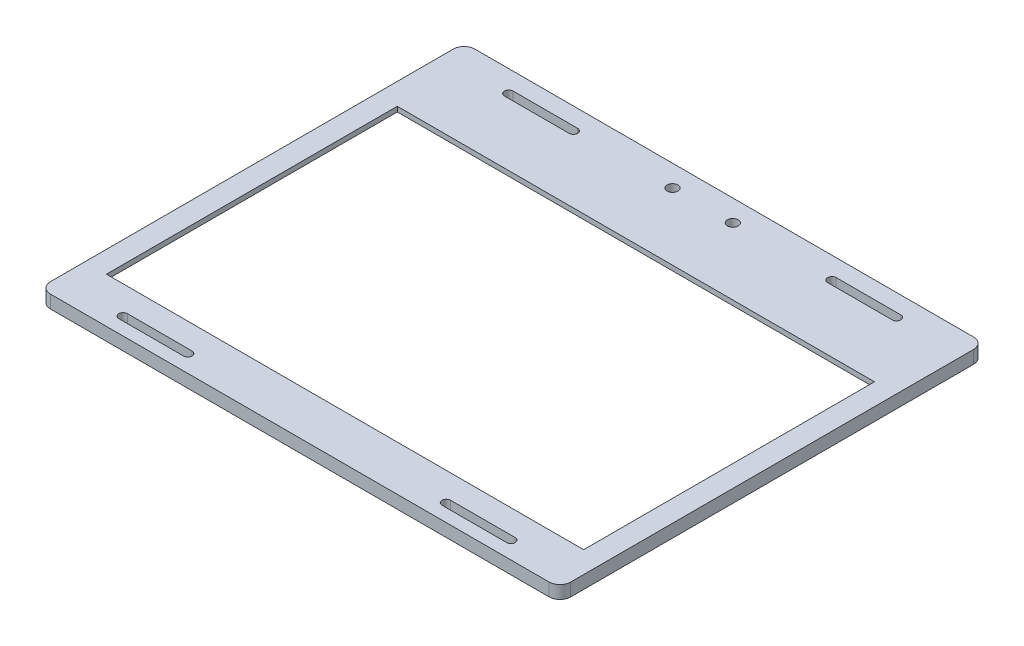
ISO-10303-21;
HEADER;
FILE_DESCRIPTION(('STEP AP214'),'2;1');
FILE_NAME('part.step','',(''),(''),'','','');
FILE_SCHEMA(('AUTOMOTIVE_DESIGN { 1 0 10303 214 1 1 1 1 }'));
ENDSEC;
DATA;
#1=APPLICATION_CONTEXT('core data for automotive mechanical design processes');
#2=APPLICATION_PROTOCOL_DEFINITION('international standard','automotive_design',2000,#1);
#3=PRODUCT_CONTEXT('',#1,'mechanical');
#4=PRODUCT('Part','Part','',(#3));
#5=PRODUCT_RELATED_PRODUCT_CATEGORY('part','',(#4));
#6=PRODUCT_DEFINITION_FORMATION('','',#4);
#7=PRODUCT_DEFINITION_CONTEXT('part definition',#1,'design');
#8=PRODUCT_DEFINITION('design','',#6,#7);
#9=PRODUCT_DEFINITION_SHAPE('','',#8);
#10=(LENGTH_UNIT() NAMED_UNIT(*) SI_UNIT(.MILLI.,.METRE.));
#11=(NAMED_UNIT(*) PLANE_ANGLE_UNIT() SI_UNIT($,.RADIAN.));
#12=(NAMED_UNIT(*) SI_UNIT($,.STERADIAN.) SOLID_ANGLE_UNIT());
#13=UNCERTAINTY_MEASURE_WITH_UNIT(LENGTH_MEASURE(1.E-05),#10,'distance_accuracy_value','');
#14=(GEOMETRIC_REPRESENTATION_CONTEXT(3) GLOBAL_UNCERTAINTY_ASSIGNED_CONTEXT((#13)) GLOBAL_UNIT_ASSIGNED_CONTEXT((#10,
#11,#12)) REPRESENTATION_CONTEXT('',''));
#15=CARTESIAN_POINT('',(0.,0.,0.));
#16=DIRECTION('',(0.,0.,1.));
#17=DIRECTION('',(1.,0.,0.));
#18=AXIS2_PLACEMENT_3D('',#15,#16,#17);
#19=CARTESIAN_POINT('',(0.,3.7,0.));
#20=DIRECTION('',(0.,1.,0.));
#21=DIRECTION('',(0.,0.,1.));
#22=AXIS2_PLACEMENT_3D('',#19,#20,#21);
#23=PLANE('',#22);
#24=DIRECTION('',(0.,0.,1.));
#25=VECTOR('',#24,1.);
#26=CARTESIAN_POINT('',(110.75,3.7,0.));
#27=LINE('',#26,#25);
#28=CARTESIAN_POINT('',(110.75,3.7,-60.));
#29=VERTEX_POINT('',#28);
#30=CARTESIAN_POINT('',(110.75,3.7,75.));
#31=VERTEX_POINT('',#30);
#32=EDGE_CURVE('E11',#29,#31,#27,.T.);
#33=ORIENTED_EDGE('',*,*,#32,.F.);
#34=DIRECTION('',(-1.,0.,0.));
#35=VECTOR('',#34,1.);
#36=CARTESIAN_POINT('',(0.,3.7,-60.));
#37=LINE('',#36,#35);
#38=CARTESIAN_POINT('',(-110.75,3.7,-60.));
#39=VERTEX_POINT('',#38);
#40=EDGE_CURVE('E47',#29,#39,#37,.T.);
#41=ORIENTED_EDGE('',*,*,#40,.T.);
#42=DIRECTION('',(0.,0.,1.));
#43=VECTOR('',#42,1.);
#44=CARTESIAN_POINT('',(-110.75,3.7,0.));
#45=LINE('',#44,#43);
#46=CARTESIAN_POINT('',(-110.75,3.7,75.));
#47=VERTEX_POINT('',#46);
#48=EDGE_CURVE('E505',#39,#47,#45,.T.);
#49=ORIENTED_EDGE('',*,*,#48,.T.);
#50=DIRECTION('',(1.,0.,0.));
#51=VECTOR('',#50,1.);
#52=CARTESIAN_POINT('',(-114.75,3.7,75.));
#53=LINE('',#52,#51);
#54=CARTESIAN_POINT('',(-114.75,3.7,75.));
#55=VERTEX_POINT('',#54);
#56=EDGE_CURVE('E255',#55,#47,#53,.T.);
#57=ORIENTED_EDGE('',*,*,#56,.F.);
#58=DIRECTION('',(0.,0.,1.));
#59=VECTOR('',#58,1.);
#60=CARTESIAN_POINT('',(-114.75,3.7,-75.));
#61=LINE('',#60,#59);
#62=CARTESIAN_POINT('',(-114.75,3.7,-75.));
#63=VERTEX_POINT('',#62);
#64=EDGE_CURVE('E277',#63,#55,#61,.T.);
#65=ORIENTED_EDGE('',*,*,#64,.F.);
#66=DIRECTION('',(1.,0.,0.));
#67=VECTOR('',#66,1.);
#68=CARTESIAN_POINT('',(-114.75,3.7,-75.));
#69=LINE('',#68,#67);
#70=CARTESIAN_POINT('',(114.75,3.7,-75.));
#71=VERTEX_POINT('',#70);
#72=EDGE_CURVE('E286',#63,#71,#69,.T.);
#73=ORIENTED_EDGE('',*,*,#72,.T.);
#74=DIRECTION('',(0.,0.,1.));
#75=VECTOR('',#74,1.);
#76=CARTESIAN_POINT('',(114.75,3.7,-75.));
#77=LINE('',#76,#75);
#78=CARTESIAN_POINT('',(114.75,3.7,75.));
#79=VERTEX_POINT('',#78);
#80=EDGE_CURVE('E283',#71,#79,#77,.T.);
#81=ORIENTED_EDGE('',*,*,#80,.T.);
#82=EDGE_CURVE('E280',#31,#79,#53,.T.);
#83=ORIENTED_EDGE('',*,*,#82,.F.);
#84=EDGE_LOOP('',(#33,#41,#49,#57,#65,#73,#81,#83));
#85=FACE_BOUND('',#84,.T.);
#86=ADVANCED_FACE('F39',(#85),#23,.F.);
#87=CARTESIAN_POINT('',(0.,0.,0.));
#88=DIRECTION('',(0.,1.,0.));
#89=DIRECTION('',(0.,0.,1.));
#90=AXIS2_PLACEMENT_3D('',#87,#88,#89);
#91=PLANE('',#90);
#92=DIRECTION('',(-1.,0.,0.));
#93=VECTOR('',#92,1.);
#94=CARTESIAN_POINT('',(0.,0.,90.));
#95=LINE('',#94,#93);
#96=CARTESIAN_POINT('',(90.,0.,89.9999999999999));
#97=VERTEX_POINT('',#96);
#98=CARTESIAN_POINT('',(60.,0.,90.));
#99=VERTEX_POINT('',#98);
#100=EDGE_CURVE('E444',#97,#99,#95,.T.);
#101=ORIENTED_EDGE('',*,*,#100,.F.);
#102=CARTESIAN_POINT('',(90.,0.,87.9999999999999));
#103=DIRECTION('',(0.,1.,0.));
#104=DIRECTION('',(0.,0.,1.));
#105=AXIS2_PLACEMENT_3D('',#102,#103,#104);
#106=CIRCLE('',#105,2.);
#107=CARTESIAN_POINT('',(90.,0.,85.9999999999999));
#108=VERTEX_POINT('',#107);
#109=EDGE_CURVE('E408',#108,#97,#106,.F.);
#110=ORIENTED_EDGE('',*,*,#109,.F.);
#111=DIRECTION('',(-1.,0.,0.));
#112=VECTOR('',#111,1.);
#113=CARTESIAN_POINT('',(0.,0.,86.));
#114=LINE('',#113,#112);
#115=CARTESIAN_POINT('',(60.,0.,86.));
#116=VERTEX_POINT('',#115);
#117=EDGE_CURVE('E450',#108,#116,#114,.T.);
#118=ORIENTED_EDGE('',*,*,#117,.T.);
#119=CARTESIAN_POINT('',(60.,0.,88.));
#120=DIRECTION('',(0.,1.,0.));
#121=DIRECTION('',(0.,0.,1.));
#122=AXIS2_PLACEMENT_3D('',#119,#120,#121);
#123=CIRCLE('',#122,2.);
#124=EDGE_CURVE('E447',#99,#116,#123,.F.);
#125=ORIENTED_EDGE('',*,*,#124,.F.);
#126=EDGE_LOOP('',(#101,#110,#118,#125));
#127=FACE_BOUND('',#126,.T.);
#128=CARTESIAN_POINT('',(-60.,0.,88.));
#129=DIRECTION('',(0.,1.,0.));
#130=DIRECTION('',(0.,0.,1.));
#131=AXIS2_PLACEMENT_3D('',#128,#129,#130);
#132=CIRCLE('',#131,2.);
#133=CARTESIAN_POINT('',(-60.,0.,90.));
#134=VERTEX_POINT('',#133);
#135=CARTESIAN_POINT('',(-60.,0.,86.));
#136=VERTEX_POINT('',#135);
#137=EDGE_CURVE('E309',#134,#136,#132,.T.);
#138=ORIENTED_EDGE('',*,*,#137,.T.);
#139=DIRECTION('',(1.,0.,0.));
#140=VECTOR('',#139,1.);
#141=CARTESIAN_POINT('',(0.,0.,86.));
#142=LINE('',#141,#140);
#143=CARTESIAN_POINT('',(-90.,0.,86.));
#144=VERTEX_POINT('',#143);
#145=EDGE_CURVE('E438',#144,#136,#142,.T.);
#146=ORIENTED_EDGE('',*,*,#145,.F.);
#147=CARTESIAN_POINT('',(-90.,0.,88.));
#148=DIRECTION('',(0.,1.,0.));
#149=DIRECTION('',(0.,0.,1.));
#150=AXIS2_PLACEMENT_3D('',#147,#148,#149);
#151=CIRCLE('',#150,2.);
#152=CARTESIAN_POINT('',(-90.,0.,90.));
#153=VERTEX_POINT('',#152);
#154=EDGE_CURVE('E435',#144,#153,#151,.T.);
#155=ORIENTED_EDGE('',*,*,#154,.T.);
#156=DIRECTION('',(1.,0.,0.));
#157=VECTOR('',#156,1.);
#158=CARTESIAN_POINT('',(0.,0.,90.));
#159=LINE('',#158,#157);
#160=EDGE_CURVE('E432',#153,#134,#159,.T.);
#161=ORIENTED_EDGE('',*,*,#160,.T.);
#162=EDGE_LOOP('',(#138,#146,#155,#161));
#163=FACE_BOUND('',#162,.T.);
#164=DIRECTION('',(-1.,0.,0.));
#165=VECTOR('',#164,1.);
#166=CARTESIAN_POINT('',(0.,0.,-89.0000000000001));
#167=LINE('',#166,#165);
#168=CARTESIAN_POINT('',(90.,0.,-89.));
#169=VERTEX_POINT('',#168);
#170=CARTESIAN_POINT('',(60.,0.,-89.));
#171=VERTEX_POINT('',#170);
#172=EDGE_CURVE('E376',#169,#171,#167,.T.);
#173=ORIENTED_EDGE('',*,*,#172,.F.);
#174=CARTESIAN_POINT('',(90.,0.,-91.));
#175=DIRECTION('',(0.,1.,0.));
#176=DIRECTION('',(0.,0.,1.));
#177=AXIS2_PLACEMENT_3D('',#174,#175,#176);
#178=CIRCLE('',#177,2.00000000000001);
#179=CARTESIAN_POINT('',(90.,0.,-93.));
#180=VERTEX_POINT('',#179);
#181=EDGE_CURVE('E314',#180,#169,#178,.F.);
#182=ORIENTED_EDGE('',*,*,#181,.F.);
#183=DIRECTION('',(-1.,0.,0.));
#184=VECTOR('',#183,1.);
#185=CARTESIAN_POINT('',(1.29063426612675E-13,0.,-93.0000000000002));
#186=LINE('',#185,#184);
#187=CARTESIAN_POINT('',(60.,0.,-93.0000000000001));
#188=VERTEX_POINT('',#187);
#189=EDGE_CURVE('E382',#180,#188,#186,.T.);
#190=ORIENTED_EDGE('',*,*,#189,.T.);
#191=CARTESIAN_POINT('',(60.,0.,-91.));
#192=DIRECTION('',(0.,1.,0.));
#193=DIRECTION('',(0.,0.,1.));
#194=AXIS2_PLACEMENT_3D('',#191,#192,#193);
#195=CIRCLE('',#194,2.00000000000002);
#196=EDGE_CURVE('E379',#171,#188,#195,.F.);
#197=ORIENTED_EDGE('',*,*,#196,.F.);
#198=EDGE_LOOP('',(#173,#182,#190,#197));
#199=FACE_BOUND('',#198,.T.);
#200=DIRECTION('',(0.,0.,-1.));
#201=VECTOR('',#200,1.);
#202=CARTESIAN_POINT('',(120.75,0.,0.));
#203=LINE('',#202,#201);
#204=CARTESIAN_POINT('',(120.75,0.,91.));
#205=VERTEX_POINT('',#204);
#206=CARTESIAN_POINT('',(120.75,0.,-96.));
#207=VERTEX_POINT('',#206);
#208=EDGE_CURVE('E367',#205,#207,#203,.T.);
#209=ORIENTED_EDGE('',*,*,#208,.F.);
#210=CARTESIAN_POINT('',(115.75,0.,91.));
#211=DIRECTION('',(0.,1.,0.));
#212=DIRECTION('',(0.,0.,1.));
#213=AXIS2_PLACEMENT_3D('',#210,#211,#212);
#214=CIRCLE('',#213,5.);
#215=CARTESIAN_POINT('',(115.75,0.,96.));
#216=VERTEX_POINT('',#215);
#217=EDGE_CURVE('E480',#205,#216,#214,.F.);
#218=ORIENTED_EDGE('',*,*,#217,.T.);
#219=DIRECTION('',(1.,0.,0.));
#220=VECTOR('',#219,1.);
#221=CARTESIAN_POINT('',(0.,0.,96.));
#222=LINE('',#221,#220);
#223=CARTESIAN_POINT('',(-115.75,0.,96.));
#224=VERTEX_POINT('',#223);
#225=EDGE_CURVE('E441',#224,#216,#222,.T.);
#226=ORIENTED_EDGE('',*,*,#225,.F.);
#227=CARTESIAN_POINT('',(-115.75,0.,91.));
#228=DIRECTION('',(0.,1.,0.));
#229=DIRECTION('',(0.,0.,1.));
#230=AXIS2_PLACEMENT_3D('',#227,#228,#229);
#231=CIRCLE('',#230,5.);
#232=CARTESIAN_POINT('',(-120.75,0.,91.));
#233=VERTEX_POINT('',#232);
#234=EDGE_CURVE('E478',#224,#233,#231,.F.);
#235=ORIENTED_EDGE('',*,*,#234,.T.);
#236=DIRECTION('',(0.,0.,-1.));
#237=VECTOR('',#236,1.);
#238=CARTESIAN_POINT('',(-120.75,0.,0.));
#239=LINE('',#238,#237);
#240=CARTESIAN_POINT('',(-120.75,0.,-96.));
#241=VERTEX_POINT('',#240);
#242=EDGE_CURVE('E373',#233,#241,#239,.T.);
#243=ORIENTED_EDGE('',*,*,#242,.T.);
#244=CARTESIAN_POINT('',(-115.75,0.,-96.));
#245=DIRECTION('',(0.,1.,0.));
#246=DIRECTION('',(0.,0.,1.));
#247=AXIS2_PLACEMENT_3D('',#244,#245,#246);
#248=CIRCLE('',#247,5.);
#249=CARTESIAN_POINT('',(-115.75,0.,-101.));
#250=VERTEX_POINT('',#249);
#251=EDGE_CURVE('E474',#241,#250,#248,.F.);
#252=ORIENTED_EDGE('',*,*,#251,.T.);
#253=DIRECTION('',(1.,0.,0.));
#254=VECTOR('',#253,1.);
#255=CARTESIAN_POINT('',(0.,0.,-101.));
#256=LINE('',#255,#254);
#257=CARTESIAN_POINT('',(115.75,0.,-101.));
#258=VERTEX_POINT('',#257);
#259=EDGE_CURVE('E370',#250,#258,#256,.T.);
#260=ORIENTED_EDGE('',*,*,#259,.T.);
#261=CARTESIAN_POINT('',(115.75,0.,-96.));
#262=DIRECTION('',(0.,1.,0.));
#263=DIRECTION('',(0.,0.,1.));
#264=AXIS2_PLACEMENT_3D('',#261,#262,#263);
#265=CIRCLE('',#264,5.);
#266=EDGE_CURVE('E476',#258,#207,#265,.F.);
#267=ORIENTED_EDGE('',*,*,#266,.T.);
#268=EDGE_LOOP('',(#209,#218,#226,#235,#243,#252,#260,#267));
#269=FACE_BOUND('',#268,.T.);
#270=CARTESIAN_POINT('',(-14.,0.,-91.));
#271=DIRECTION('',(0.,1.,0.));
#272=DIRECTION('',(0.,0.,1.));
#273=AXIS2_PLACEMENT_3D('',#270,#271,#272);
#274=CIRCLE('',#273,2.5);
#275=CARTESIAN_POINT('',(-14.,0.,-88.5));
#276=VERTEX_POINT('',#275);
#277=EDGE_CURVE('E364',#276,#276,#274,.T.);
#278=ORIENTED_EDGE('',*,*,#277,.T.);
#279=EDGE_LOOP('',(#278));
#280=FACE_BOUND('',#279,.T.);
#281=CARTESIAN_POINT('',(14.,0.,-91.));
#282=DIRECTION('',(0.,1.,0.));
#283=DIRECTION('',(0.,0.,1.));
#284=AXIS2_PLACEMENT_3D('',#281,#282,#283);
#285=CIRCLE('',#284,2.5);
#286=CARTESIAN_POINT('',(14.,0.,-88.5));
#287=VERTEX_POINT('',#286);
#288=EDGE_CURVE('E361',#287,#287,#285,.T.);
#289=ORIENTED_EDGE('',*,*,#288,.T.);
#290=EDGE_LOOP('',(#289));
#291=FACE_BOUND('',#290,.T.);
#292=CARTESIAN_POINT('',(-60.,0.,-91.));
#293=DIRECTION('',(0.,1.,0.));
#294=DIRECTION('',(0.,0.,1.));
#295=AXIS2_PLACEMENT_3D('',#292,#293,#294);
#296=CIRCLE('',#295,2.00000000000001);
#297=CARTESIAN_POINT('',(-60.,0.,-89.));
#298=VERTEX_POINT('',#297);
#299=CARTESIAN_POINT('',(-60.,0.,-93.));
#300=VERTEX_POINT('',#299);
#301=EDGE_CURVE('E348',#298,#300,#296,.T.);
#302=ORIENTED_EDGE('',*,*,#301,.T.);
#303=DIRECTION('',(1.,0.,0.));
#304=VECTOR('',#303,1.);
#305=CARTESIAN_POINT('',(0.,0.,-93.0000000000001));
#306=LINE('',#305,#304);
#307=CARTESIAN_POINT('',(-90.,0.,-93.));
#308=VERTEX_POINT('',#307);
#309=EDGE_CURVE('E358',#308,#300,#306,.T.);
#310=ORIENTED_EDGE('',*,*,#309,.F.);
#311=CARTESIAN_POINT('',(-90.,0.,-91.));
#312=DIRECTION('',(0.,1.,0.));
#313=DIRECTION('',(0.,0.,1.));
#314=AXIS2_PLACEMENT_3D('',#311,#312,#313);
#315=CIRCLE('',#314,2.00000000000001);
#316=CARTESIAN_POINT('',(-90.,0.,-89.));
#317=VERTEX_POINT('',#316);
#318=EDGE_CURVE('E355',#308,#317,#315,.T.);
#319=ORIENTED_EDGE('',*,*,#318,.T.);
#320=DIRECTION('',(1.,0.,0.));
#321=VECTOR('',#320,1.);
#322=CARTESIAN_POINT('',(0.,0.,-89.0000000000001));
#323=LINE('',#322,#321);
#324=EDGE_CURVE('E351',#317,#298,#323,.T.);
#325=ORIENTED_EDGE('',*,*,#324,.T.);
#326=EDGE_LOOP('',(#302,#310,#319,#325));
#327=FACE_BOUND('',#326,.T.);
#328=DIRECTION('',(0.,0.,1.));
#329=VECTOR('',#328,1.);
#330=CARTESIAN_POINT('',(-114.75,0.,-75.));
#331=LINE('',#330,#329);
#332=CARTESIAN_POINT('',(-114.75,0.,-75.));
#333=VERTEX_POINT('',#332);
#334=CARTESIAN_POINT('',(-114.75,0.,75.));
#335=VERTEX_POINT('',#334);
#336=EDGE_CURVE('E272',#333,#335,#331,.T.);
#337=ORIENTED_EDGE('',*,*,#336,.T.);
#338=DIRECTION('',(1.,0.,0.));
#339=VECTOR('',#338,1.);
#340=CARTESIAN_POINT('',(-114.75,0.,75.));
#341=LINE('',#340,#339);
#342=CARTESIAN_POINT('',(114.75,0.,75.));
#343=VERTEX_POINT('',#342);
#344=EDGE_CURVE('E292',#335,#343,#341,.T.);
#345=ORIENTED_EDGE('',*,*,#344,.T.);
#346=DIRECTION('',(0.,0.,1.));
#347=VECTOR('',#346,1.);
#348=CARTESIAN_POINT('',(114.75,0.,-75.));
#349=LINE('',#348,#347);
#350=CARTESIAN_POINT('',(114.75,0.,-75.));
#351=VERTEX_POINT('',#350);
#352=EDGE_CURVE('E294',#351,#343,#349,.T.);
#353=ORIENTED_EDGE('',*,*,#352,.F.);
#354=DIRECTION('',(1.,0.,0.));
#355=VECTOR('',#354,1.);
#356=CARTESIAN_POINT('',(-114.75,0.,-75.));
#357=LINE('',#356,#355);
#358=EDGE_CURVE('E281',#333,#351,#357,.T.);
#359=ORIENTED_EDGE('',*,*,#358,.F.);
#360=EDGE_LOOP('',(#337,#345,#353,#359));
#361=FACE_BOUND('',#360,.T.);
#362=ADVANCED_FACE('F524',(#127,#163,#199,#269,#280,#291,#327,#361),#91,.F.);
#363=CARTESIAN_POINT('',(0.,6.,-89.0000000000001));
#364=DIRECTION('',(0.,0.,1.));
#365=DIRECTION('',(1.,0.,0.));
#366=AXIS2_PLACEMENT_3D('',#363,#364,#365);
#367=PLANE('',#366);
#368=ORIENTED_EDGE('',*,*,#172,.T.);
#369=DIRECTION('',(0.,-1.,0.));
#370=VECTOR('',#369,1.);
#371=CARTESIAN_POINT('',(60.,6.,-89.));
#372=LINE('',#371,#370);
#373=CARTESIAN_POINT('',(60.,6.,-89.));
#374=VERTEX_POINT('',#373);
#375=EDGE_CURVE('E394',#374,#171,#372,.T.);
#376=ORIENTED_EDGE('',*,*,#375,.F.);
#377=DIRECTION('',(-1.,0.,0.));
#378=VECTOR('',#377,1.);
#379=CARTESIAN_POINT('',(0.,6.,-89.0000000000001));
#380=LINE('',#379,#378);
#381=CARTESIAN_POINT('',(90.,6.,-89.));
#382=VERTEX_POINT('',#381);
#383=EDGE_CURVE('E337',#382,#374,#380,.T.);
#384=ORIENTED_EDGE('',*,*,#383,.F.);
#385=DIRECTION('',(0.,-1.,0.));
#386=VECTOR('',#385,1.);
#387=CARTESIAN_POINT('',(90.,6.,-89.));
#388=LINE('',#387,#386);
#389=EDGE_CURVE('E386',#382,#169,#388,.T.);
#390=ORIENTED_EDGE('',*,*,#389,.T.);
#391=EDGE_LOOP('',(#368,#376,#384,#390));
#392=FACE_BOUND('',#391,.T.);
#393=ADVANCED_FACE('F543',(#392),#367,.F.);
#394=CARTESIAN_POINT('',(60.,6.,-91.));
#395=DIRECTION('',(0.,-1.,0.));
#396=DIRECTION('',(0.,0.,-1.));
#397=AXIS2_PLACEMENT_3D('',#394,#395,#396);
#398=CYLINDRICAL_SURFACE('',#397,2.00000000000002);
#399=ORIENTED_EDGE('',*,*,#196,.T.);
#400=DIRECTION('',(0.,-1.,0.));
#401=VECTOR('',#400,1.);
#402=CARTESIAN_POINT('',(60.,6.,-93.0000000000001));
#403=LINE('',#402,#401);
#404=CARTESIAN_POINT('',(60.,6.,-93.0000000000001));
#405=VERTEX_POINT('',#404);
#406=EDGE_CURVE('E392',#405,#188,#403,.T.);
#407=ORIENTED_EDGE('',*,*,#406,.F.);
#408=CARTESIAN_POINT('',(60.,6.,-91.));
#409=DIRECTION('',(0.,1.,0.));
#410=DIRECTION('',(0.,0.,1.));
#411=AXIS2_PLACEMENT_3D('',#408,#409,#410);
#412=CIRCLE('',#411,2.00000000000002);
#413=EDGE_CURVE('E340',#374,#405,#412,.F.);
#414=ORIENTED_EDGE('',*,*,#413,.F.);
#415=ORIENTED_EDGE('',*,*,#375,.T.);
#416=EDGE_LOOP('',(#399,#407,#414,#415));
#417=FACE_BOUND('',#416,.T.);
#418=ADVANCED_FACE('F877',(#417),#398,.F.);
#419=CARTESIAN_POINT('',(1.29063426612675E-13,6.,-93.0000000000002));
#420=DIRECTION('',(0.,0.,1.));
#421=DIRECTION('',(1.,0.,0.));
#422=AXIS2_PLACEMENT_3D('',#419,#420,#421);
#423=PLANE('',#422);
#424=ORIENTED_EDGE('',*,*,#189,.F.);
#425=DIRECTION('',(0.,-1.,0.));
#426=VECTOR('',#425,1.);
#427=CARTESIAN_POINT('',(90.,6.,-93.));
#428=LINE('',#427,#426);
#429=CARTESIAN_POINT('',(90.,6.,-93.));
#430=VERTEX_POINT('',#429);
#431=EDGE_CURVE('E389',#430,#180,#428,.T.);
#432=ORIENTED_EDGE('',*,*,#431,.F.);
#433=DIRECTION('',(-1.,0.,0.));
#434=VECTOR('',#433,1.);
#435=CARTESIAN_POINT('',(1.29063426612675E-13,6.,-93.0000000000002));
#436=LINE('',#435,#434);
#437=EDGE_CURVE('E342',#430,#405,#436,.T.);
#438=ORIENTED_EDGE('',*,*,#437,.T.);
#439=ORIENTED_EDGE('',*,*,#406,.T.);
#440=EDGE_LOOP('',(#424,#432,#438,#439));
#441=FACE_BOUND('',#440,.T.);
#442=ADVANCED_FACE('F770',(#441),#423,.T.);
#443=CARTESIAN_POINT('',(120.75,6.,0.));
#444=DIRECTION('',(-1.,0.,0.));
#445=DIRECTION('',(0.,0.,1.));
#446=AXIS2_PLACEMENT_3D('',#443,#444,#445);
#447=PLANE('',#446);
#448=DIRECTION('',(0.,0.,-1.));
#449=VECTOR('',#448,1.);
#450=CARTESIAN_POINT('',(120.75,6.,0.));
#451=LINE('',#450,#449);
#452=CARTESIAN_POINT('',(120.75,6.,91.));
#453=VERTEX_POINT('',#452);
#454=CARTESIAN_POINT('',(120.75,6.,-96.));
#455=VERTEX_POINT('',#454);
#456=EDGE_CURVE('E328',#453,#455,#451,.T.);
#457=ORIENTED_EDGE('',*,*,#456,.F.);
#458=DIRECTION('',(0.,-1.,0.));
#459=VECTOR('',#458,1.);
#460=CARTESIAN_POINT('',(120.75,6.,91.));
#461=LINE('',#460,#459);
#462=EDGE_CURVE('E471',#453,#205,#461,.T.);
#463=ORIENTED_EDGE('',*,*,#462,.T.);
#464=ORIENTED_EDGE('',*,*,#208,.T.);
#465=DIRECTION('',(0.,-1.,0.));
#466=VECTOR('',#465,1.);
#467=CARTESIAN_POINT('',(120.75,6.,-96.));
#468=LINE('',#467,#466);
#469=EDGE_CURVE('E397',#207,#455,#468,.F.);
#470=ORIENTED_EDGE('',*,*,#469,.T.);
#471=EDGE_LOOP('',(#457,#463,#464,#470));
#472=FACE_BOUND('',#471,.T.);
#473=ADVANCED_FACE('F586',(#472),#447,.F.);
#474=CARTESIAN_POINT('',(0.,6.,-101.));
#475=DIRECTION('',(0.,0.,-1.));
#476=DIRECTION('',(-1.,0.,0.));
#477=AXIS2_PLACEMENT_3D('',#474,#475,#476);
#478=PLANE('',#477);
#479=DIRECTION('',(1.,0.,0.));
#480=VECTOR('',#479,1.);
#481=CARTESIAN_POINT('',(0.,6.,-101.));
#482=LINE('',#481,#480);
#483=CARTESIAN_POINT('',(-115.75,6.,-101.));
#484=VERTEX_POINT('',#483);
#485=CARTESIAN_POINT('',(115.75,6.,-101.));
#486=VERTEX_POINT('',#485);
#487=EDGE_CURVE('E331',#484,#486,#482,.T.);
#488=ORIENTED_EDGE('',*,*,#487,.T.);
#489=DIRECTION('',(0.,-1.,0.));
#490=VECTOR('',#489,1.);
#491=CARTESIAN_POINT('',(115.75,0.,-101.));
#492=LINE('',#491,#490);
#493=EDGE_CURVE('E502',#486,#258,#492,.T.);
#494=ORIENTED_EDGE('',*,*,#493,.T.);
#495=ORIENTED_EDGE('',*,*,#259,.F.);
#496=DIRECTION('',(0.,-1.,0.));
#497=VECTOR('',#496,1.);
#498=CARTESIAN_POINT('',(-115.75,6.,-101.));
#499=LINE('',#498,#497);
#500=EDGE_CURVE('E500',#250,#484,#499,.F.);
#501=ORIENTED_EDGE('',*,*,#500,.T.);
#502=EDGE_LOOP('',(#488,#494,#495,#501));
#503=FACE_BOUND('',#502,.T.);
#504=ADVANCED_FACE('F591',(#503),#478,.T.);
#505=CARTESIAN_POINT('',(-60.,6.,-91.));
#506=DIRECTION('',(0.,-1.,0.));
#507=DIRECTION('',(0.,0.,-1.));
#508=AXIS2_PLACEMENT_3D('',#505,#506,#507);
#509=CYLINDRICAL_SURFACE('',#508,2.00000000000001);
#510=ORIENTED_EDGE('',*,*,#301,.F.);
#511=DIRECTION('',(0.,-1.,0.));
#512=VECTOR('',#511,1.);
#513=CARTESIAN_POINT('',(-60.,6.,-89.));
#514=LINE('',#513,#512);
#515=CARTESIAN_POINT('',(-60.,6.,-89.));
#516=VERTEX_POINT('',#515);
#517=EDGE_CURVE('E390',#516,#298,#514,.T.);
#518=ORIENTED_EDGE('',*,*,#517,.F.);
#519=CARTESIAN_POINT('',(-60.,6.,-91.));
#520=DIRECTION('',(0.,1.,0.));
#521=DIRECTION('',(0.,0.,1.));
#522=AXIS2_PLACEMENT_3D('',#519,#520,#521);
#523=CIRCLE('',#522,2.00000000000001);
#524=CARTESIAN_POINT('',(-60.,6.,-93.));
#525=VERTEX_POINT('',#524);
#526=EDGE_CURVE('E310',#516,#525,#523,.T.);
#527=ORIENTED_EDGE('',*,*,#526,.T.);
#528=DIRECTION('',(0.,-1.,0.));
#529=VECTOR('',#528,1.);
#530=CARTESIAN_POINT('',(-60.,6.,-93.));
#531=LINE('',#530,#529);
#532=EDGE_CURVE('E347',#525,#300,#531,.T.);
#533=ORIENTED_EDGE('',*,*,#532,.T.);
#534=EDGE_LOOP('',(#510,#518,#527,#533));
#535=FACE_BOUND('',#534,.T.);
#536=ADVANCED_FACE('F604',(#535),#509,.F.);
#537=CARTESIAN_POINT('',(0.,6.,-89.0000000000001));
#538=DIRECTION('',(0.,0.,-1.));
#539=DIRECTION('',(-1.,0.,0.));
#540=AXIS2_PLACEMENT_3D('',#537,#538,#539);
#541=PLANE('',#540);
#542=ORIENTED_EDGE('',*,*,#324,.F.);
#543=DIRECTION('',(0.,-1.,0.));
#544=VECTOR('',#543,1.);
#545=CARTESIAN_POINT('',(-90.,6.,-89.));
#546=LINE('',#545,#544);
#547=CARTESIAN_POINT('',(-90.,6.,-89.));
#548=VERTEX_POINT('',#547);
#549=EDGE_CURVE('E401',#548,#317,#546,.T.);
#550=ORIENTED_EDGE('',*,*,#549,.F.);
#551=DIRECTION('',(1.,0.,0.));
#552=VECTOR('',#551,1.);
#553=CARTESIAN_POINT('',(0.,6.,-89.0000000000001));
#554=LINE('',#553,#552);
#555=EDGE_CURVE('E313',#548,#516,#554,.T.);
#556=ORIENTED_EDGE('',*,*,#555,.T.);
#557=ORIENTED_EDGE('',*,*,#517,.T.);
#558=EDGE_LOOP('',(#542,#550,#556,#557));
#559=FACE_BOUND('',#558,.T.);
#560=ADVANCED_FACE('F615',(#559),#541,.T.);
#561=CARTESIAN_POINT('',(-90.,6.,-91.));
#562=DIRECTION('',(0.,-1.,0.));
#563=DIRECTION('',(0.,0.,-1.));
#564=AXIS2_PLACEMENT_3D('',#561,#562,#563);
#565=CYLINDRICAL_SURFACE('',#564,2.00000000000001);
#566=ORIENTED_EDGE('',*,*,#318,.F.);
#567=DIRECTION('',(0.,-1.,0.));
#568=VECTOR('',#567,1.);
#569=CARTESIAN_POINT('',(-90.,6.,-93.));
#570=LINE('',#569,#568);
#571=CARTESIAN_POINT('',(-90.,6.,-93.));
#572=VERTEX_POINT('',#571);
#573=EDGE_CURVE('E399',#572,#308,#570,.T.);
#574=ORIENTED_EDGE('',*,*,#573,.F.);
#575=CARTESIAN_POINT('',(-90.,6.,-91.));
#576=DIRECTION('',(0.,1.,0.));
#577=DIRECTION('',(0.,0.,1.));
#578=AXIS2_PLACEMENT_3D('',#575,#576,#577);
#579=CIRCLE('',#578,2.00000000000001);
#580=EDGE_CURVE('E317',#572,#548,#579,.T.);
#581=ORIENTED_EDGE('',*,*,#580,.T.);
#582=ORIENTED_EDGE('',*,*,#549,.T.);
#583=EDGE_LOOP('',(#566,#574,#581,#582));
#584=FACE_BOUND('',#583,.T.);
#585=ADVANCED_FACE('F612',(#584),#565,.F.);
#586=CARTESIAN_POINT('',(-120.75,6.,0.));
#587=DIRECTION('',(-1.,0.,0.));
#588=DIRECTION('',(0.,0.,1.));
#589=AXIS2_PLACEMENT_3D('',#586,#587,#588);
#590=PLANE('',#589);
#591=ORIENTED_EDGE('',*,*,#242,.F.);
#592=DIRECTION('',(0.,-1.,0.));
#593=VECTOR('',#592,1.);
#594=CARTESIAN_POINT('',(-120.75,6.,91.));
#595=LINE('',#594,#593);
#596=CARTESIAN_POINT('',(-120.75,6.,91.));
#597=VERTEX_POINT('',#596);
#598=EDGE_CURVE('E498',#233,#597,#595,.F.);
#599=ORIENTED_EDGE('',*,*,#598,.T.);
#600=DIRECTION('',(0.,0.,-1.));
#601=VECTOR('',#600,1.);
#602=CARTESIAN_POINT('',(-120.75,6.,0.));
#603=LINE('',#602,#601);
#604=CARTESIAN_POINT('',(-120.75,6.,-96.));
#605=VERTEX_POINT('',#604);
#606=EDGE_CURVE('E334',#597,#605,#603,.T.);
#607=ORIENTED_EDGE('',*,*,#606,.T.);
#608=DIRECTION('',(0.,-1.,0.));
#609=VECTOR('',#608,1.);
#610=CARTESIAN_POINT('',(-120.75,6.,-96.));
#611=LINE('',#610,#609);
#612=EDGE_CURVE('E495',#605,#241,#611,.T.);
#613=ORIENTED_EDGE('',*,*,#612,.T.);
#614=EDGE_LOOP('',(#591,#599,#607,#613));
#615=FACE_BOUND('',#614,.T.);
#616=ADVANCED_FACE('F572',(#615),#590,.T.);
#617=CARTESIAN_POINT('',(-14.,6.,-91.));
#618=DIRECTION('',(0.,-1.,0.));
#619=DIRECTION('',(0.,0.,-1.));
#620=AXIS2_PLACEMENT_3D('',#617,#618,#619);
#621=CYLINDRICAL_SURFACE('',#620,2.5);
#622=CARTESIAN_POINT('',(-14.,6.,-91.));
#623=DIRECTION('',(0.,1.,0.));
#624=DIRECTION('',(0.,0.,1.));
#625=AXIS2_PLACEMENT_3D('',#622,#623,#624);
#626=CIRCLE('',#625,2.5);
#627=CARTESIAN_POINT('',(-14.,6.,-88.5));
#628=VERTEX_POINT('',#627);
#629=EDGE_CURVE('E325',#628,#628,#626,.T.);
#630=ORIENTED_EDGE('',*,*,#629,.T.);
#631=EDGE_LOOP('',(#630));
#632=FACE_BOUND('',#631,.T.);
#633=ORIENTED_EDGE('',*,*,#277,.F.);
#634=EDGE_LOOP('',(#633));
#635=FACE_BOUND('',#634,.T.);
#636=ADVANCED_FACE('F625',(#632,#635),#621,.F.);
#637=CARTESIAN_POINT('',(14.,6.,-91.));
#638=DIRECTION('',(0.,-1.,0.));
#639=DIRECTION('',(0.,0.,-1.));
#640=AXIS2_PLACEMENT_3D('',#637,#638,#639);
#641=CYLINDRICAL_SURFACE('',#640,2.5);
#642=CARTESIAN_POINT('',(14.,6.,-91.));
#643=DIRECTION('',(0.,1.,0.));
#644=DIRECTION('',(0.,0.,1.));
#645=AXIS2_PLACEMENT_3D('',#642,#643,#644);
#646=CIRCLE('',#645,2.5);
#647=CARTESIAN_POINT('',(14.,6.,-88.5));
#648=VERTEX_POINT('',#647);
#649=EDGE_CURVE('E322',#648,#648,#646,.T.);
#650=ORIENTED_EDGE('',*,*,#649,.T.);
#651=EDGE_LOOP('',(#650));
#652=FACE_BOUND('',#651,.T.);
#653=ORIENTED_EDGE('',*,*,#288,.F.);
#654=EDGE_LOOP('',(#653));
#655=FACE_BOUND('',#654,.T.);
#656=ADVANCED_FACE('F628',(#652,#655),#641,.F.);
#657=CARTESIAN_POINT('',(0.,6.,-93.0000000000001));
#658=DIRECTION('',(0.,0.,-1.));
#659=DIRECTION('',(-1.,0.,0.));
#660=AXIS2_PLACEMENT_3D('',#657,#658,#659);
#661=PLANE('',#660);
#662=ORIENTED_EDGE('',*,*,#309,.T.);
#663=ORIENTED_EDGE('',*,*,#532,.F.);
#664=DIRECTION('',(1.,0.,0.));
#665=VECTOR('',#664,1.);
#666=CARTESIAN_POINT('',(0.,6.,-93.0000000000001));
#667=LINE('',#666,#665);
#668=EDGE_CURVE('E320',#572,#525,#667,.T.);
#669=ORIENTED_EDGE('',*,*,#668,.F.);
#670=ORIENTED_EDGE('',*,*,#573,.T.);
#671=EDGE_LOOP('',(#662,#663,#669,#670));
#672=FACE_BOUND('',#671,.T.);
#673=ADVANCED_FACE('F609',(#672),#661,.F.);
#674=CARTESIAN_POINT('',(90.,6.,-91.));
#675=DIRECTION('',(0.,-1.,0.));
#676=DIRECTION('',(0.,0.,-1.));
#677=AXIS2_PLACEMENT_3D('',#674,#675,#676);
#678=CYLINDRICAL_SURFACE('',#677,2.00000000000001);
#679=ORIENTED_EDGE('',*,*,#181,.T.);
#680=ORIENTED_EDGE('',*,*,#389,.F.);
#681=CARTESIAN_POINT('',(90.,6.,-91.));
#682=DIRECTION('',(0.,1.,0.));
#683=DIRECTION('',(0.,0.,1.));
#684=AXIS2_PLACEMENT_3D('',#681,#682,#683);
#685=CIRCLE('',#684,2.00000000000001);
#686=EDGE_CURVE('E345',#430,#382,#685,.F.);
#687=ORIENTED_EDGE('',*,*,#686,.F.);
#688=ORIENTED_EDGE('',*,*,#431,.T.);
#689=EDGE_LOOP('',(#679,#680,#687,#688));
#690=FACE_BOUND('',#689,.T.);
#691=ADVANCED_FACE('F619',(#690),#678,.F.);
#692=CARTESIAN_POINT('',(0.,6.,0.));
#693=DIRECTION('',(0.,1.,0.));
#694=DIRECTION('',(0.,0.,1.));
#695=AXIS2_PLACEMENT_3D('',#692,#693,#694);
#696=PLANE('',#695);
#697=DIRECTION('',(-1.,0.,0.));
#698=VECTOR('',#697,1.);
#699=CARTESIAN_POINT('',(0.,6.,75.));
#700=LINE('',#699,#698);
#701=CARTESIAN_POINT('',(110.75,6.,75.));
#702=VERTEX_POINT('',#701);
#703=CARTESIAN_POINT('',(-110.75,6.,75.));
#704=VERTEX_POINT('',#703);
#705=EDGE_CURVE('E252',#702,#704,#700,.T.);
#706=ORIENTED_EDGE('',*,*,#705,.T.);
#707=DIRECTION('',(0.,0.,-1.));
#708=VECTOR('',#707,1.);
#709=CARTESIAN_POINT('',(-110.75,6.,0.));
#710=LINE('',#709,#708);
#711=CARTESIAN_POINT('',(-110.75,6.,-60.));
#712=VERTEX_POINT('',#711);
#713=EDGE_CURVE('E260',#704,#712,#710,.T.);
#714=ORIENTED_EDGE('',*,*,#713,.T.);
#715=DIRECTION('',(1.,0.,0.));
#716=VECTOR('',#715,1.);
#717=CARTESIAN_POINT('',(0.,6.,-60.));
#718=LINE('',#717,#716);
#719=CARTESIAN_POINT('',(110.75,6.,-60.));
#720=VERTEX_POINT('',#719);
#721=EDGE_CURVE('E54',#712,#720,#718,.T.);
#722=ORIENTED_EDGE('',*,*,#721,.T.);
#723=DIRECTION('',(0.,0.,-1.));
#724=VECTOR('',#723,1.);
#725=CARTESIAN_POINT('',(110.75,6.,0.));
#726=LINE('',#725,#724);
#727=EDGE_CURVE('E257',#702,#720,#726,.T.);
#728=ORIENTED_EDGE('',*,*,#727,.F.);
#729=EDGE_LOOP('',(#706,#714,#722,#728));
#730=FACE_BOUND('',#729,.T.);
#731=ORIENTED_EDGE('',*,*,#526,.F.);
#732=ORIENTED_EDGE('',*,*,#555,.F.);
#733=ORIENTED_EDGE('',*,*,#580,.F.);
#734=ORIENTED_EDGE('',*,*,#668,.T.);
#735=EDGE_LOOP('',(#731,#732,#733,#734));
#736=FACE_BOUND('',#735,.T.);
#737=ORIENTED_EDGE('',*,*,#649,.F.);
#738=EDGE_LOOP('',(#737));
#739=FACE_BOUND('',#738,.T.);
#740=ORIENTED_EDGE('',*,*,#629,.F.);
#741=EDGE_LOOP('',(#740));
#742=FACE_BOUND('',#741,.T.);
#743=DIRECTION('',(1.,0.,0.));
#744=VECTOR('',#743,1.);
#745=CARTESIAN_POINT('',(0.,6.,96.));
#746=LINE('',#745,#744);
#747=CARTESIAN_POINT('',(-115.75,6.,96.));
#748=VERTEX_POINT('',#747);
#749=CARTESIAN_POINT('',(115.75,6.,96.));
#750=VERTEX_POINT('',#749);
#751=EDGE_CURVE('E416',#748,#750,#746,.T.);
#752=ORIENTED_EDGE('',*,*,#751,.T.);
#753=CARTESIAN_POINT('',(115.75,6.,91.));
#754=DIRECTION('',(0.,1.,0.));
#755=DIRECTION('',(0.,0.,1.));
#756=AXIS2_PLACEMENT_3D('',#753,#754,#755);
#757=CIRCLE('',#756,5.);
#758=EDGE_CURVE('E493',#750,#453,#757,.T.);
#759=ORIENTED_EDGE('',*,*,#758,.T.);
#760=ORIENTED_EDGE('',*,*,#456,.T.);
#761=CARTESIAN_POINT('',(115.75,6.,-96.));
#762=DIRECTION('',(0.,1.,0.));
#763=DIRECTION('',(0.,0.,1.));
#764=AXIS2_PLACEMENT_3D('',#761,#762,#763);
#765=CIRCLE('',#764,5.);
#766=EDGE_CURVE('E489',#455,#486,#765,.T.);
#767=ORIENTED_EDGE('',*,*,#766,.T.);
#768=ORIENTED_EDGE('',*,*,#487,.F.);
#769=CARTESIAN_POINT('',(-115.75,6.,-96.));
#770=DIRECTION('',(0.,1.,0.));
#771=DIRECTION('',(0.,0.,1.));
#772=AXIS2_PLACEMENT_3D('',#769,#770,#771);
#773=CIRCLE('',#772,5.);
#774=EDGE_CURVE('E487',#484,#605,#773,.T.);
#775=ORIENTED_EDGE('',*,*,#774,.T.);
#776=ORIENTED_EDGE('',*,*,#606,.F.);
#777=CARTESIAN_POINT('',(-115.75,6.,91.));
#778=DIRECTION('',(0.,1.,0.));
#779=DIRECTION('',(0.,0.,1.));
#780=AXIS2_PLACEMENT_3D('',#777,#778,#779);
#781=CIRCLE('',#780,5.);
#782=EDGE_CURVE('E491',#597,#748,#781,.T.);
#783=ORIENTED_EDGE('',*,*,#782,.T.);
#784=EDGE_LOOP('',(#752,#759,#760,#767,#768,#775,#776,#783));
#785=FACE_BOUND('',#784,.T.);
#786=ORIENTED_EDGE('',*,*,#383,.T.);
#787=ORIENTED_EDGE('',*,*,#413,.T.);
#788=ORIENTED_EDGE('',*,*,#437,.F.);
#789=ORIENTED_EDGE('',*,*,#686,.T.);
#790=EDGE_LOOP('',(#786,#787,#788,#789));
#791=FACE_BOUND('',#790,.T.);
#792=CARTESIAN_POINT('',(-60.,6.,88.));
#793=DIRECTION('',(0.,1.,0.));
#794=DIRECTION('',(0.,0.,1.));
#795=AXIS2_PLACEMENT_3D('',#792,#793,#794);
#796=CIRCLE('',#795,2.);
#797=CARTESIAN_POINT('',(-60.,6.,90.));
#798=VERTEX_POINT('',#797);
#799=CARTESIAN_POINT('',(-60.,6.,86.));
#800=VERTEX_POINT('',#799);
#801=EDGE_CURVE('E404',#798,#800,#796,.T.);
#802=ORIENTED_EDGE('',*,*,#801,.F.);
#803=DIRECTION('',(1.,0.,0.));
#804=VECTOR('',#803,1.);
#805=CARTESIAN_POINT('',(0.,6.,90.));
#806=LINE('',#805,#804);
#807=CARTESIAN_POINT('',(-90.,6.,90.));
#808=VERTEX_POINT('',#807);
#809=EDGE_CURVE('E407',#808,#798,#806,.T.);
#810=ORIENTED_EDGE('',*,*,#809,.F.);
#811=CARTESIAN_POINT('',(-90.,6.,88.));
#812=DIRECTION('',(0.,1.,0.));
#813=DIRECTION('',(0.,0.,1.));
#814=AXIS2_PLACEMENT_3D('',#811,#812,#813);
#815=CIRCLE('',#814,2.);
#816=CARTESIAN_POINT('',(-90.,6.,86.));
#817=VERTEX_POINT('',#816);
#818=EDGE_CURVE('E411',#817,#808,#815,.T.);
#819=ORIENTED_EDGE('',*,*,#818,.F.);
#820=DIRECTION('',(1.,0.,0.));
#821=VECTOR('',#820,1.);
#822=CARTESIAN_POINT('',(0.,6.,86.));
#823=LINE('',#822,#821);
#824=EDGE_CURVE('E414',#817,#800,#823,.T.);
#825=ORIENTED_EDGE('',*,*,#824,.T.);
#826=EDGE_LOOP('',(#802,#810,#819,#825));
#827=FACE_BOUND('',#826,.T.);
#828=DIRECTION('',(-1.,0.,0.));
#829=VECTOR('',#828,1.);
#830=CARTESIAN_POINT('',(0.,6.,90.));
#831=LINE('',#830,#829);
#832=CARTESIAN_POINT('',(90.,6.,89.9999999999999));
#833=VERTEX_POINT('',#832);
#834=CARTESIAN_POINT('',(60.,6.,90.));
#835=VERTEX_POINT('',#834);
#836=EDGE_CURVE('E419',#833,#835,#831,.T.);
#837=ORIENTED_EDGE('',*,*,#836,.T.);
#838=CARTESIAN_POINT('',(60.,6.,88.));
#839=DIRECTION('',(0.,1.,0.));
#840=DIRECTION('',(0.,0.,1.));
#841=AXIS2_PLACEMENT_3D('',#838,#839,#840);
#842=CIRCLE('',#841,2.);
#843=CARTESIAN_POINT('',(60.,6.,86.));
#844=VERTEX_POINT('',#843);
#845=EDGE_CURVE('E422',#835,#844,#842,.F.);
#846=ORIENTED_EDGE('',*,*,#845,.T.);
#847=DIRECTION('',(-1.,0.,0.));
#848=VECTOR('',#847,1.);
#849=CARTESIAN_POINT('',(0.,6.,86.));
#850=LINE('',#849,#848);
#851=CARTESIAN_POINT('',(90.,6.,85.9999999999999));
#852=VERTEX_POINT('',#851);
#853=EDGE_CURVE('E424',#852,#844,#850,.T.);
#854=ORIENTED_EDGE('',*,*,#853,.F.);
#855=CARTESIAN_POINT('',(90.,6.,87.9999999999999));
#856=DIRECTION('',(0.,1.,0.));
#857=DIRECTION('',(0.,0.,1.));
#858=AXIS2_PLACEMENT_3D('',#855,#856,#857);
#859=CIRCLE('',#858,2.);
#860=EDGE_CURVE('E427',#852,#833,#859,.F.);
#861=ORIENTED_EDGE('',*,*,#860,.T.);
#862=EDGE_LOOP('',(#837,#846,#854,#861));
#863=FACE_BOUND('',#862,.T.);
#864=ADVANCED_FACE('F264',(#730,#736,#739,#742,#785,#791,#827,#863),#696,.T.);
#865=CARTESIAN_POINT('',(90.,6.,87.9999999999999));
#866=DIRECTION('',(0.,-1.,0.));
#867=DIRECTION('',(0.,0.,-1.));
#868=AXIS2_PLACEMENT_3D('',#865,#866,#867);
#869=CYLINDRICAL_SURFACE('',#868,2.);
#870=ORIENTED_EDGE('',*,*,#109,.T.);
#871=DIRECTION('',(0.,-1.,0.));
#872=VECTOR('',#871,1.);
#873=CARTESIAN_POINT('',(90.,6.,89.9999999999999));
#874=LINE('',#873,#872);
#875=EDGE_CURVE('E454',#833,#97,#874,.T.);
#876=ORIENTED_EDGE('',*,*,#875,.F.);
#877=ORIENTED_EDGE('',*,*,#860,.F.);
#878=DIRECTION('',(0.,-1.,0.));
#879=VECTOR('',#878,1.);
#880=CARTESIAN_POINT('',(90.,6.,85.9999999999999));
#881=LINE('',#880,#879);
#882=EDGE_CURVE('E457',#852,#108,#881,.T.);
#883=ORIENTED_EDGE('',*,*,#882,.T.);
#884=EDGE_LOOP('',(#870,#876,#877,#883));
#885=FACE_BOUND('',#884,.T.);
#886=ADVANCED_FACE('F618',(#885),#869,.F.);
#887=CARTESIAN_POINT('',(0.,6.,86.));
#888=DIRECTION('',(0.,0.,1.));
#889=DIRECTION('',(1.,0.,0.));
#890=AXIS2_PLACEMENT_3D('',#887,#888,#889);
#891=PLANE('',#890);
#892=ORIENTED_EDGE('',*,*,#117,.F.);
#893=ORIENTED_EDGE('',*,*,#882,.F.);
#894=ORIENTED_EDGE('',*,*,#853,.T.);
#895=DIRECTION('',(0.,-1.,0.));
#896=VECTOR('',#895,1.);
#897=CARTESIAN_POINT('',(60.,6.,86.));
#898=LINE('',#897,#896);
#899=EDGE_CURVE('E460',#844,#116,#898,.T.);
#900=ORIENTED_EDGE('',*,*,#899,.T.);
#901=EDGE_LOOP('',(#892,#893,#894,#900));
#902=FACE_BOUND('',#901,.T.);
#903=ADVANCED_FACE('F650',(#902),#891,.T.);
#904=CARTESIAN_POINT('',(60.,6.,88.));
#905=DIRECTION('',(0.,-1.,0.));
#906=DIRECTION('',(0.,0.,-1.));
#907=AXIS2_PLACEMENT_3D('',#904,#905,#906);
#908=CYLINDRICAL_SURFACE('',#907,2.);
#909=ORIENTED_EDGE('',*,*,#124,.T.);
#910=ORIENTED_EDGE('',*,*,#899,.F.);
#911=ORIENTED_EDGE('',*,*,#845,.F.);
#912=DIRECTION('',(0.,-1.,0.));
#913=VECTOR('',#912,1.);
#914=CARTESIAN_POINT('',(60.,6.,90.));
#915=LINE('',#914,#913);
#916=EDGE_CURVE('E352',#835,#99,#915,.T.);
#917=ORIENTED_EDGE('',*,*,#916,.T.);
#918=EDGE_LOOP('',(#909,#910,#911,#917));
#919=FACE_BOUND('',#918,.T.);
#920=ADVANCED_FACE('F655',(#919),#908,.F.);
#921=CARTESIAN_POINT('',(0.,6.,90.));
#922=DIRECTION('',(0.,0.,1.));
#923=DIRECTION('',(1.,0.,0.));
#924=AXIS2_PLACEMENT_3D('',#921,#922,#923);
#925=PLANE('',#924);
#926=ORIENTED_EDGE('',*,*,#100,.T.);
#927=ORIENTED_EDGE('',*,*,#916,.F.);
#928=ORIENTED_EDGE('',*,*,#836,.F.);
#929=ORIENTED_EDGE('',*,*,#875,.T.);
#930=EDGE_LOOP('',(#926,#927,#928,#929));
#931=FACE_BOUND('',#930,.T.);
#932=ADVANCED_FACE('F546',(#931),#925,.F.);
#933=CARTESIAN_POINT('',(0.,6.,86.));
#934=DIRECTION('',(0.,0.,-1.));
#935=DIRECTION('',(-1.,0.,0.));
#936=AXIS2_PLACEMENT_3D('',#933,#934,#935);
#937=PLANE('',#936);
#938=ORIENTED_EDGE('',*,*,#145,.T.);
#939=DIRECTION('',(0.,-1.,0.));
#940=VECTOR('',#939,1.);
#941=CARTESIAN_POINT('',(-60.,6.,86.));
#942=LINE('',#941,#940);
#943=EDGE_CURVE('E429',#800,#136,#942,.T.);
#944=ORIENTED_EDGE('',*,*,#943,.F.);
#945=ORIENTED_EDGE('',*,*,#824,.F.);
#946=DIRECTION('',(0.,-1.,0.));
#947=VECTOR('',#946,1.);
#948=CARTESIAN_POINT('',(-90.,6.,86.));
#949=LINE('',#948,#947);
#950=EDGE_CURVE('E465',#817,#144,#949,.T.);
#951=ORIENTED_EDGE('',*,*,#950,.T.);
#952=EDGE_LOOP('',(#938,#944,#945,#951));
#953=FACE_BOUND('',#952,.T.);
#954=ADVANCED_FACE('F652',(#953),#937,.F.);
#955=CARTESIAN_POINT('',(-90.,6.,88.));
#956=DIRECTION('',(0.,-1.,0.));
#957=DIRECTION('',(0.,0.,-1.));
#958=AXIS2_PLACEMENT_3D('',#955,#956,#957);
#959=CYLINDRICAL_SURFACE('',#958,2.);
#960=ORIENTED_EDGE('',*,*,#154,.F.);
#961=ORIENTED_EDGE('',*,*,#950,.F.);
#962=ORIENTED_EDGE('',*,*,#818,.T.);
#963=DIRECTION('',(0.,-1.,0.));
#964=VECTOR('',#963,1.);
#965=CARTESIAN_POINT('',(-90.,6.,90.));
#966=LINE('',#965,#964);
#967=EDGE_CURVE('E467',#808,#153,#966,.T.);
#968=ORIENTED_EDGE('',*,*,#967,.T.);
#969=EDGE_LOOP('',(#960,#961,#962,#968));
#970=FACE_BOUND('',#969,.T.);
#971=ADVANCED_FACE('F666',(#970),#959,.F.);
#972=CARTESIAN_POINT('',(0.,6.,90.));
#973=DIRECTION('',(0.,0.,-1.));
#974=DIRECTION('',(-1.,0.,0.));
#975=AXIS2_PLACEMENT_3D('',#972,#973,#974);
#976=PLANE('',#975);
#977=ORIENTED_EDGE('',*,*,#160,.F.);
#978=ORIENTED_EDGE('',*,*,#967,.F.);
#979=ORIENTED_EDGE('',*,*,#809,.T.);
#980=DIRECTION('',(0.,-1.,0.));
#981=VECTOR('',#980,1.);
#982=CARTESIAN_POINT('',(-60.,6.,90.));
#983=LINE('',#982,#981);
#984=EDGE_CURVE('E458',#798,#134,#983,.T.);
#985=ORIENTED_EDGE('',*,*,#984,.T.);
#986=EDGE_LOOP('',(#977,#978,#979,#985));
#987=FACE_BOUND('',#986,.T.);
#988=ADVANCED_FACE('F672',(#987),#976,.T.);
#989=CARTESIAN_POINT('',(-60.,6.,88.));
#990=DIRECTION('',(0.,-1.,0.));
#991=DIRECTION('',(0.,0.,-1.));
#992=AXIS2_PLACEMENT_3D('',#989,#990,#991);
#993=CYLINDRICAL_SURFACE('',#992,2.);
#994=ORIENTED_EDGE('',*,*,#137,.F.);
#995=ORIENTED_EDGE('',*,*,#984,.F.);
#996=ORIENTED_EDGE('',*,*,#801,.T.);
#997=ORIENTED_EDGE('',*,*,#943,.T.);
#998=EDGE_LOOP('',(#994,#995,#996,#997));
#999=FACE_BOUND('',#998,.T.);
#1000=ADVANCED_FACE('F657',(#999),#993,.F.);
#1001=CARTESIAN_POINT('',(0.,6.,96.));
#1002=DIRECTION('',(0.,0.,-1.));
#1003=DIRECTION('',(-1.,0.,0.));
#1004=AXIS2_PLACEMENT_3D('',#1001,#1002,#1003);
#1005=PLANE('',#1004);
#1006=ORIENTED_EDGE('',*,*,#225,.T.);
#1007=DIRECTION('',(0.,-1.,0.));
#1008=VECTOR('',#1007,1.);
#1009=CARTESIAN_POINT('',(115.75,6.,96.));
#1010=LINE('',#1009,#1008);
#1011=EDGE_CURVE('E485',#216,#750,#1010,.F.);
#1012=ORIENTED_EDGE('',*,*,#1011,.T.);
#1013=ORIENTED_EDGE('',*,*,#751,.F.);
#1014=DIRECTION('',(0.,-1.,0.));
#1015=VECTOR('',#1014,1.);
#1016=CARTESIAN_POINT('',(-115.75,0.,96.));
#1017=LINE('',#1016,#1015);
#1018=EDGE_CURVE('E482',#748,#224,#1017,.T.);
#1019=ORIENTED_EDGE('',*,*,#1018,.T.);
#1020=EDGE_LOOP('',(#1006,#1012,#1013,#1019));
#1021=FACE_BOUND('',#1020,.T.);
#1022=ADVANCED_FACE('F579',(#1021),#1005,.F.);
#1023=CARTESIAN_POINT('',(-114.75,3.7,-75.));
#1024=DIRECTION('',(1.,0.,0.));
#1025=DIRECTION('',(0.,0.,-1.));
#1026=AXIS2_PLACEMENT_3D('',#1023,#1024,#1025);
#1027=PLANE('',#1026);
#1028=ORIENTED_EDGE('',*,*,#336,.F.);
#1029=DIRECTION('',(0.,-1.,0.));
#1030=VECTOR('',#1029,1.);
#1031=CARTESIAN_POINT('',(-114.75,3.7,-75.));
#1032=LINE('',#1031,#1030);
#1033=EDGE_CURVE('E289',#63,#333,#1032,.T.);
#1034=ORIENTED_EDGE('',*,*,#1033,.F.);
#1035=ORIENTED_EDGE('',*,*,#64,.T.);
#1036=DIRECTION('',(0.,-1.,0.));
#1037=VECTOR('',#1036,1.);
#1038=CARTESIAN_POINT('',(-114.75,3.7,75.));
#1039=LINE('',#1038,#1037);
#1040=EDGE_CURVE('E306',#55,#335,#1039,.T.);
#1041=ORIENTED_EDGE('',*,*,#1040,.T.);
#1042=EDGE_LOOP('',(#1028,#1034,#1035,#1041));
#1043=FACE_BOUND('',#1042,.T.);
#1044=ADVANCED_FACE('F522',(#1043),#1027,.T.);
#1045=CARTESIAN_POINT('',(-114.75,3.7,75.));
#1046=DIRECTION('',(0.,0.,-1.));
#1047=DIRECTION('',(-1.,0.,0.));
#1048=AXIS2_PLACEMENT_3D('',#1045,#1046,#1047);
#1049=PLANE('',#1048);
#1050=ORIENTED_EDGE('',*,*,#56,.T.);
#1051=DIRECTION('',(0.,-1.,0.));
#1052=VECTOR('',#1051,1.);
#1053=CARTESIAN_POINT('',(-110.75,6.,75.));
#1054=LINE('',#1053,#1052);
#1055=EDGE_CURVE('E62',#704,#47,#1054,.T.);
#1056=ORIENTED_EDGE('',*,*,#1055,.F.);
#1057=ORIENTED_EDGE('',*,*,#705,.F.);
#1058=DIRECTION('',(0.,-1.,0.));
#1059=VECTOR('',#1058,1.);
#1060=CARTESIAN_POINT('',(110.75,6.,75.));
#1061=LINE('',#1060,#1059);
#1062=EDGE_CURVE('E270',#702,#31,#1061,.T.);
#1063=ORIENTED_EDGE('',*,*,#1062,.T.);
#1064=ORIENTED_EDGE('',*,*,#82,.T.);
#1065=DIRECTION('',(0.,-1.,0.));
#1066=VECTOR('',#1065,1.);
#1067=CARTESIAN_POINT('',(114.75,3.7,75.));
#1068=LINE('',#1067,#1066);
#1069=EDGE_CURVE('E303',#79,#343,#1068,.T.);
#1070=ORIENTED_EDGE('',*,*,#1069,.T.);
#1071=ORIENTED_EDGE('',*,*,#344,.F.);
#1072=ORIENTED_EDGE('',*,*,#1040,.F.);
#1073=EDGE_LOOP('',(#1050,#1056,#1057,#1063,#1064,#1070,#1071,#1072));
#1074=FACE_BOUND('',#1073,.T.);
#1075=ADVANCED_FACE('F249',(#1074),#1049,.T.);
#1076=CARTESIAN_POINT('',(114.75,3.7,-75.));
#1077=DIRECTION('',(1.,0.,0.));
#1078=DIRECTION('',(0.,0.,-1.));
#1079=AXIS2_PLACEMENT_3D('',#1076,#1077,#1078);
#1080=PLANE('',#1079);
#1081=ORIENTED_EDGE('',*,*,#352,.T.);
#1082=ORIENTED_EDGE('',*,*,#1069,.F.);
#1083=ORIENTED_EDGE('',*,*,#80,.F.);
#1084=DIRECTION('',(0.,-1.,0.));
#1085=VECTOR('',#1084,1.);
#1086=CARTESIAN_POINT('',(114.75,3.7,-75.));
#1087=LINE('',#1086,#1085);
#1088=EDGE_CURVE('E301',#71,#351,#1087,.T.);
#1089=ORIENTED_EDGE('',*,*,#1088,.T.);
#1090=EDGE_LOOP('',(#1081,#1082,#1083,#1089));
#1091=FACE_BOUND('',#1090,.T.);
#1092=ADVANCED_FACE('F518',(#1091),#1080,.F.);
#1093=CARTESIAN_POINT('',(-114.75,3.7,-75.));
#1094=DIRECTION('',(0.,0.,-1.));
#1095=DIRECTION('',(-1.,0.,0.));
#1096=AXIS2_PLACEMENT_3D('',#1093,#1094,#1095);
#1097=PLANE('',#1096);
#1098=ORIENTED_EDGE('',*,*,#358,.T.);
#1099=ORIENTED_EDGE('',*,*,#1088,.F.);
#1100=ORIENTED_EDGE('',*,*,#72,.F.);
#1101=ORIENTED_EDGE('',*,*,#1033,.T.);
#1102=EDGE_LOOP('',(#1098,#1099,#1100,#1101));
#1103=FACE_BOUND('',#1102,.T.);
#1104=ADVANCED_FACE('F526',(#1103),#1097,.F.);
#1105=CARTESIAN_POINT('',(115.75,6.,91.));
#1106=DIRECTION('',(0.,-1.,0.));
#1107=DIRECTION('',(0.,0.,-1.));
#1108=AXIS2_PLACEMENT_3D('',#1105,#1106,#1107);
#1109=CYLINDRICAL_SURFACE('',#1108,5.);
#1110=ORIENTED_EDGE('',*,*,#758,.F.);
#1111=ORIENTED_EDGE('',*,*,#1011,.F.);
#1112=ORIENTED_EDGE('',*,*,#217,.F.);
#1113=ORIENTED_EDGE('',*,*,#462,.F.);
#1114=EDGE_LOOP('',(#1110,#1111,#1112,#1113));
#1115=FACE_BOUND('',#1114,.T.);
#1116=ADVANCED_FACE('F528',(#1115),#1109,.T.);
#1117=CARTESIAN_POINT('',(-115.75,6.,91.));
#1118=DIRECTION('',(0.,1.,0.));
#1119=DIRECTION('',(0.,0.,1.));
#1120=AXIS2_PLACEMENT_3D('',#1117,#1118,#1119);
#1121=CYLINDRICAL_SURFACE('',#1120,5.);
#1122=ORIENTED_EDGE('',*,*,#782,.F.);
#1123=ORIENTED_EDGE('',*,*,#598,.F.);
#1124=ORIENTED_EDGE('',*,*,#234,.F.);
#1125=ORIENTED_EDGE('',*,*,#1018,.F.);
#1126=EDGE_LOOP('',(#1122,#1123,#1124,#1125));
#1127=FACE_BOUND('',#1126,.T.);
#1128=ADVANCED_FACE('F534',(#1127),#1121,.T.);
#1129=CARTESIAN_POINT('',(115.75,6.,-96.));
#1130=DIRECTION('',(0.,1.,0.));
#1131=DIRECTION('',(0.,0.,1.));
#1132=AXIS2_PLACEMENT_3D('',#1129,#1130,#1131);
#1133=CYLINDRICAL_SURFACE('',#1132,5.);
#1134=ORIENTED_EDGE('',*,*,#766,.F.);
#1135=ORIENTED_EDGE('',*,*,#469,.F.);
#1136=ORIENTED_EDGE('',*,*,#266,.F.);
#1137=ORIENTED_EDGE('',*,*,#493,.F.);
#1138=EDGE_LOOP('',(#1134,#1135,#1136,#1137));
#1139=FACE_BOUND('',#1138,.T.);
#1140=ADVANCED_FACE('F556',(#1139),#1133,.T.);
#1141=CARTESIAN_POINT('',(-115.75,6.,-96.));
#1142=DIRECTION('',(0.,-1.,0.));
#1143=DIRECTION('',(0.,0.,-1.));
#1144=AXIS2_PLACEMENT_3D('',#1141,#1142,#1143);
#1145=CYLINDRICAL_SURFACE('',#1144,5.);
#1146=ORIENTED_EDGE('',*,*,#774,.F.);
#1147=ORIENTED_EDGE('',*,*,#500,.F.);
#1148=ORIENTED_EDGE('',*,*,#251,.F.);
#1149=ORIENTED_EDGE('',*,*,#612,.F.);
#1150=EDGE_LOOP('',(#1146,#1147,#1148,#1149));
#1151=FACE_BOUND('',#1150,.T.);
#1152=ADVANCED_FACE('F41',(#1151),#1145,.T.);
#1153=CARTESIAN_POINT('',(110.75,6.,0.));
#1154=DIRECTION('',(-1.,0.,0.));
#1155=DIRECTION('',(0.,0.,1.));
#1156=AXIS2_PLACEMENT_3D('',#1153,#1154,#1155);
#1157=PLANE('',#1156);
#1158=ORIENTED_EDGE('',*,*,#32,.T.);
#1159=ORIENTED_EDGE('',*,*,#1062,.F.);
#1160=ORIENTED_EDGE('',*,*,#727,.T.);
#1161=DIRECTION('',(0.,-1.,0.));
#1162=VECTOR('',#1161,1.);
#1163=CARTESIAN_POINT('',(110.75,6.,-60.));
#1164=LINE('',#1163,#1162);
#1165=EDGE_CURVE('E273',#720,#29,#1164,.T.);
#1166=ORIENTED_EDGE('',*,*,#1165,.T.);
#1167=EDGE_LOOP('',(#1158,#1159,#1160,#1166));
#1168=FACE_BOUND('',#1167,.T.);
#1169=ADVANCED_FACE('F512',(#1168),#1157,.T.);
#1170=CARTESIAN_POINT('',(0.,6.,-60.));
#1171=DIRECTION('',(0.,0.,-1.));
#1172=DIRECTION('',(-1.,0.,0.));
#1173=AXIS2_PLACEMENT_3D('',#1170,#1171,#1172);
#1174=PLANE('',#1173);
#1175=ORIENTED_EDGE('',*,*,#1165,.F.);
#1176=ORIENTED_EDGE('',*,*,#721,.F.);
#1177=DIRECTION('',(0.,-1.,0.));
#1178=VECTOR('',#1177,1.);
#1179=CARTESIAN_POINT('',(-110.75,6.,-60.));
#1180=LINE('',#1179,#1178);
#1181=EDGE_CURVE('E256',#712,#39,#1180,.T.);
#1182=ORIENTED_EDGE('',*,*,#1181,.T.);
#1183=ORIENTED_EDGE('',*,*,#40,.F.);
#1184=EDGE_LOOP('',(#1175,#1176,#1182,#1183));
#1185=FACE_BOUND('',#1184,.T.);
#1186=ADVANCED_FACE('F510',(#1185),#1174,.F.);
#1187=CARTESIAN_POINT('',(-110.75,6.,0.));
#1188=DIRECTION('',(-1.,0.,0.));
#1189=DIRECTION('',(0.,0.,1.));
#1190=AXIS2_PLACEMENT_3D('',#1187,#1188,#1189);
#1191=PLANE('',#1190);
#1192=ORIENTED_EDGE('',*,*,#1181,.F.);
#1193=ORIENTED_EDGE('',*,*,#713,.F.);
#1194=ORIENTED_EDGE('',*,*,#1055,.T.);
#1195=ORIENTED_EDGE('',*,*,#48,.F.);
#1196=EDGE_LOOP('',(#1192,#1193,#1194,#1195));
#1197=FACE_BOUND('',#1196,.T.);
#1198=ADVANCED_FACE('F261',(#1197),#1191,.F.);
#1199=CLOSED_SHELL('',(#86,#362,#393,#418,#442,#473,#504,#536,#560,#585,#616,#636,#656,#673,
#691,#864,#886,#903,#920,#932,#954,#971,#988,#1000,#1022,#1044,#1075,#1092,#1104,#1116,#1128,
#1140,#1152,#1169,#1186,#1198));
#1200=MANIFOLD_SOLID_BREP('B2',#1199);
#1201=ADVANCED_BREP_SHAPE_REPRESENTATION('',(#18,#1200),#14);
#1202=SHAPE_DEFINITION_REPRESENTATION(#9,#1201);
ENDSEC;
END-ISO-10303-21;
